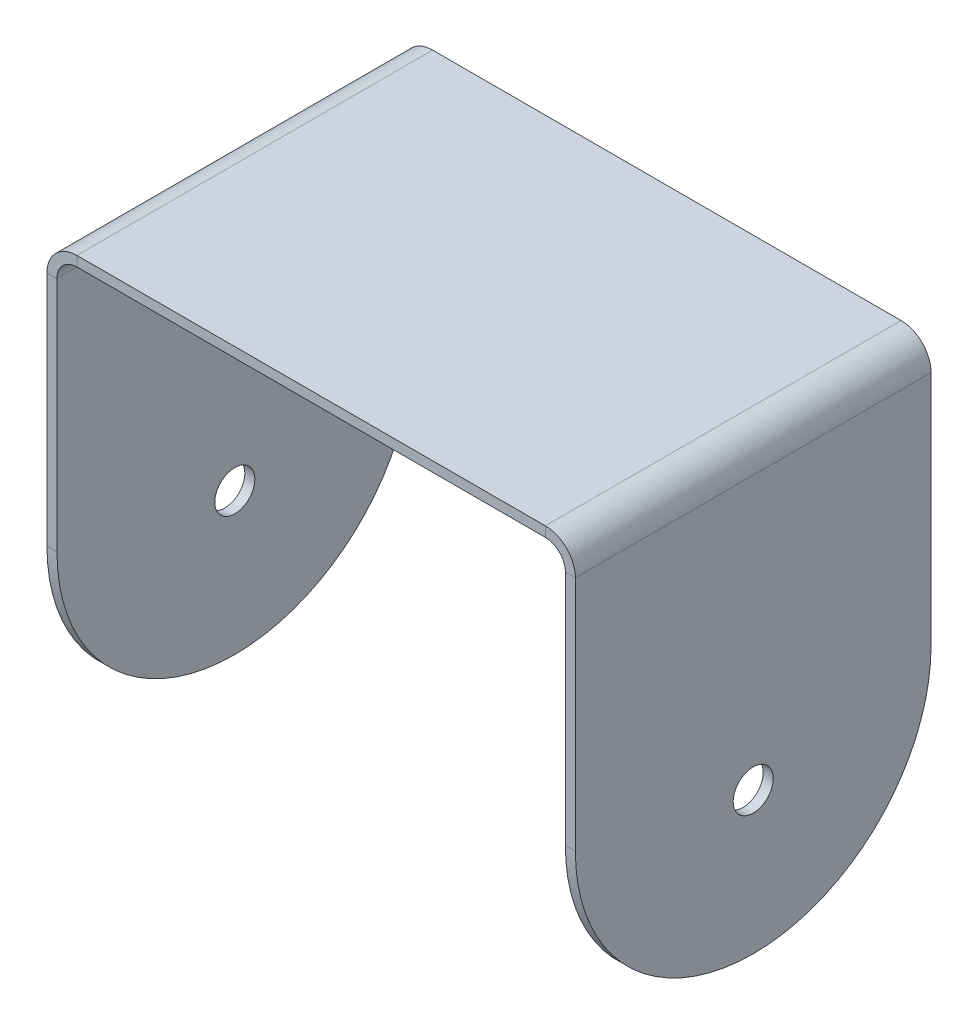
ISO-10303-21;
HEADER;
FILE_DESCRIPTION(('STEP AP214'),'2;1');
FILE_NAME('part.step','',(''),(''),'','','');
FILE_SCHEMA(('AUTOMOTIVE_DESIGN { 1 0 10303 214 1 1 1 1 }'));
ENDSEC;
DATA;
#1=APPLICATION_CONTEXT('core data for automotive mechanical design processes');
#2=APPLICATION_PROTOCOL_DEFINITION('international standard','automotive_design',2000,#1);
#3=PRODUCT_CONTEXT('',#1,'mechanical');
#4=PRODUCT('Part','Part','',(#3));
#5=PRODUCT_RELATED_PRODUCT_CATEGORY('part','',(#4));
#6=PRODUCT_DEFINITION_FORMATION('','',#4);
#7=PRODUCT_DEFINITION_CONTEXT('part definition',#1,'design');
#8=PRODUCT_DEFINITION('design','',#6,#7);
#9=PRODUCT_DEFINITION_SHAPE('','',#8);
#10=(LENGTH_UNIT() NAMED_UNIT(*) SI_UNIT(.MILLI.,.METRE.));
#11=(NAMED_UNIT(*) PLANE_ANGLE_UNIT() SI_UNIT($,.RADIAN.));
#12=(NAMED_UNIT(*) SI_UNIT($,.STERADIAN.) SOLID_ANGLE_UNIT());
#13=UNCERTAINTY_MEASURE_WITH_UNIT(LENGTH_MEASURE(1.E-05),#10,'distance_accuracy_value','');
#14=(GEOMETRIC_REPRESENTATION_CONTEXT(3) GLOBAL_UNCERTAINTY_ASSIGNED_CONTEXT((#13)) GLOBAL_UNIT_ASSIGNED_CONTEXT((#10,
#11,#12)) REPRESENTATION_CONTEXT('',''));
#15=CARTESIAN_POINT('',(0.,0.,0.));
#16=DIRECTION('',(0.,0.,1.));
#17=DIRECTION('',(1.,0.,0.));
#18=AXIS2_PLACEMENT_3D('',#15,#16,#17);
#19=CARTESIAN_POINT('',(34.3408,3.87818391192708,5.334));
#20=DIRECTION('',(0.,0.,1.));
#21=DIRECTION('',(-1.,0.,0.));
#22=AXIS2_PLACEMENT_3D('',#19,#20,#21);
#23=PLANE('',#22);
#24=DIRECTION('',(0.,1.,0.));
#25=VECTOR('',#24,1.);
#26=CARTESIAN_POINT('',(-30.4407999168,3.87818391192708,5.334));
#27=LINE('',#26,#25);
#28=CARTESIAN_POINT('',(-30.4407999168,2.57818391192708,5.334));
#29=VERTEX_POINT('',#28);
#30=CARTESIAN_POINT('',(-30.4407999168,3.87818391192708,5.334));
#31=VERTEX_POINT('',#30);
#32=EDGE_CURVE('E11',#29,#31,#27,.T.);
#33=ORIENTED_EDGE('',*,*,#32,.F.);
#34=DIRECTION('',(1.,0.,0.));
#35=VECTOR('',#34,1.);
#36=CARTESIAN_POINT('',(34.3408,2.57818391192708,5.334));
#37=LINE('',#36,#35);
#38=CARTESIAN_POINT('',(30.4407999168,2.57818391192708,5.334));
#39=VERTEX_POINT('',#38);
#40=EDGE_CURVE('E101',#39,#29,#37,.F.);
#41=ORIENTED_EDGE('',*,*,#40,.F.);
#42=DIRECTION('',(0.,1.,0.));
#43=VECTOR('',#42,1.);
#44=CARTESIAN_POINT('',(30.4407999168,3.87818391192708,5.334));
#45=LINE('',#44,#43);
#46=CARTESIAN_POINT('',(30.4407999168,3.87818391192708,5.334));
#47=VERTEX_POINT('',#46);
#48=EDGE_CURVE('E54',#39,#47,#45,.T.);
#49=ORIENTED_EDGE('',*,*,#48,.T.);
#50=DIRECTION('',(-1.,0.,0.));
#51=VECTOR('',#50,1.);
#52=CARTESIAN_POINT('',(34.3408,3.87818391192708,5.334));
#53=LINE('',#52,#51);
#54=EDGE_CURVE('E103',#47,#31,#53,.T.);
#55=ORIENTED_EDGE('',*,*,#54,.T.);
#56=EDGE_LOOP('',(#33,#41,#49,#55));
#57=FACE_BOUND('',#56,.T.);
#58=ADVANCED_FACE('F43',(#57),#23,.T.);
#59=CARTESIAN_POINT('',(30.4407999168,-0.0218161712729221,5.334));
#60=DIRECTION('',(0.,0.,1.));
#61=DIRECTION('',(0.,-1.,0.));
#62=AXIS2_PLACEMENT_3D('',#59,#60,#61);
#63=PLANE('',#62);
#64=ORIENTED_EDGE('',*,*,#48,.F.);
#65=CARTESIAN_POINT('',(30.4407999168,-0.0218161712729221,5.334));
#66=DIRECTION('',(0.,0.,1.));
#67=DIRECTION('',(0.,-1.,0.));
#68=AXIS2_PLACEMENT_3D('',#65,#66,#67);
#69=CIRCLE('',#68,2.6000000832);
#70=CARTESIAN_POINT('',(33.0408,-0.0218161712729221,5.334));
#71=VERTEX_POINT('',#70);
#72=EDGE_CURVE('E148',#39,#71,#69,.F.);
#73=ORIENTED_EDGE('',*,*,#72,.T.);
#74=DIRECTION('',(1.,0.,0.));
#75=VECTOR('',#74,1.);
#76=CARTESIAN_POINT('',(34.3408,-0.0218161712729221,5.334));
#77=LINE('',#76,#75);
#78=CARTESIAN_POINT('',(34.3408,-0.0218161712729221,5.334));
#79=VERTEX_POINT('',#78);
#80=EDGE_CURVE('E187',#71,#79,#77,.T.);
#81=ORIENTED_EDGE('',*,*,#80,.T.);
#82=CARTESIAN_POINT('',(30.4407999168,-0.0218161712729221,5.334));
#83=DIRECTION('',(0.,0.,-1.));
#84=DIRECTION('',(0.,1.,0.));
#85=AXIS2_PLACEMENT_3D('',#82,#83,#84);
#86=CIRCLE('',#85,3.9000000832);
#87=EDGE_CURVE('E257',#47,#79,#86,.T.);
#88=ORIENTED_EDGE('',*,*,#87,.F.);
#89=EDGE_LOOP('',(#64,#73,#81,#88));
#90=FACE_BOUND('',#89,.T.);
#91=ADVANCED_FACE('F301',(#90),#63,.T.);
#92=CARTESIAN_POINT('',(34.3408,-30.7928160880729,5.33400000000001));
#93=DIRECTION('',(0.,0.,-1.));
#94=DIRECTION('',(0.,-1.,0.));
#95=AXIS2_PLACEMENT_3D('',#92,#93,#94);
#96=PLANE('',#95);
#97=ORIENTED_EDGE('',*,*,#80,.F.);
#98=DIRECTION('',(0.,1.,0.));
#99=VECTOR('',#98,1.);
#100=CARTESIAN_POINT('',(33.0408,-30.7928160880729,5.334));
#101=LINE('',#100,#99);
#102=CARTESIAN_POINT('',(33.0408,-30.7928160880729,5.334));
#103=VERTEX_POINT('',#102);
#104=EDGE_CURVE('E155',#71,#103,#101,.F.);
#105=ORIENTED_EDGE('',*,*,#104,.T.);
#106=DIRECTION('',(1.,0.,0.));
#107=VECTOR('',#106,1.);
#108=CARTESIAN_POINT('',(34.3408,-30.7928160880729,5.334));
#109=LINE('',#108,#107);
#110=CARTESIAN_POINT('',(34.3408,-30.7928160880729,5.334));
#111=VERTEX_POINT('',#110);
#112=EDGE_CURVE('E183',#103,#111,#109,.T.);
#113=ORIENTED_EDGE('',*,*,#112,.T.);
#114=DIRECTION('',(0.,-1.,0.));
#115=VECTOR('',#114,1.);
#116=CARTESIAN_POINT('',(34.3408,-30.7928160880729,5.33400000000001));
#117=LINE('',#116,#115);
#118=EDGE_CURVE('E238',#79,#111,#117,.T.);
#119=ORIENTED_EDGE('',*,*,#118,.F.);
#120=EDGE_LOOP('',(#97,#105,#113,#119));
#121=FACE_BOUND('',#120,.T.);
#122=ADVANCED_FACE('F317',(#121),#96,.F.);
#123=CARTESIAN_POINT('',(34.3408,-30.7928160880729,-17.78));
#124=DIRECTION('',(-1.,0.,0.));
#125=DIRECTION('',(0.,0.,1.));
#126=AXIS2_PLACEMENT_3D('',#123,#124,#125);
#127=CYLINDRICAL_SURFACE('',#126,23.114);
#128=ORIENTED_EDGE('',*,*,#112,.F.);
#129=CARTESIAN_POINT('',(33.0408,-30.7928160880729,-17.78));
#130=DIRECTION('',(1.,0.,0.));
#131=DIRECTION('',(0.,0.,-1.));
#132=AXIS2_PLACEMENT_3D('',#129,#130,#131);
#133=CIRCLE('',#132,23.114);
#134=CARTESIAN_POINT('',(33.0408,-30.7928160880729,-40.894));
#135=VERTEX_POINT('',#134);
#136=EDGE_CURVE('E289',#103,#135,#133,.T.);
#137=ORIENTED_EDGE('',*,*,#136,.T.);
#138=DIRECTION('',(1.,0.,0.));
#139=VECTOR('',#138,1.);
#140=CARTESIAN_POINT('',(34.3408,-30.7928160880729,-40.894));
#141=LINE('',#140,#139);
#142=CARTESIAN_POINT('',(34.3408,-30.7928160880729,-40.894));
#143=VERTEX_POINT('',#142);
#144=EDGE_CURVE('E179',#135,#143,#141,.T.);
#145=ORIENTED_EDGE('',*,*,#144,.T.);
#146=CARTESIAN_POINT('',(34.3408,-30.7928160880729,-17.78));
#147=DIRECTION('',(1.,0.,0.));
#148=DIRECTION('',(0.,0.,1.));
#149=AXIS2_PLACEMENT_3D('',#146,#147,#148);
#150=CIRCLE('',#149,23.114);
#151=EDGE_CURVE('E234',#111,#143,#150,.T.);
#152=ORIENTED_EDGE('',*,*,#151,.F.);
#153=EDGE_LOOP('',(#128,#137,#145,#152));
#154=FACE_BOUND('',#153,.T.);
#155=ADVANCED_FACE('F313',(#154),#127,.T.);
#156=CARTESIAN_POINT('',(34.3408,3.87818391192708,-40.894));
#157=DIRECTION('',(0.,0.,1.));
#158=DIRECTION('',(0.,1.,0.));
#159=AXIS2_PLACEMENT_3D('',#156,#157,#158);
#160=PLANE('',#159);
#161=ORIENTED_EDGE('',*,*,#144,.F.);
#162=DIRECTION('',(0.,1.,0.));
#163=VECTOR('',#162,1.);
#164=CARTESIAN_POINT('',(33.0408,-30.7928160880729,-40.894));
#165=LINE('',#164,#163);
#166=CARTESIAN_POINT('',(33.0408,-0.0218161712729131,-40.894));
#167=VERTEX_POINT('',#166);
#168=EDGE_CURVE('E134',#135,#167,#165,.T.);
#169=ORIENTED_EDGE('',*,*,#168,.T.);
#170=DIRECTION('',(1.,0.,0.));
#171=VECTOR('',#170,1.);
#172=CARTESIAN_POINT('',(34.3408,-0.0218161712729136,-40.894));
#173=LINE('',#172,#171);
#174=CARTESIAN_POINT('',(34.3408,-0.0218161712729136,-40.894));
#175=VERTEX_POINT('',#174);
#176=EDGE_CURVE('E175',#167,#175,#173,.T.);
#177=ORIENTED_EDGE('',*,*,#176,.T.);
#178=DIRECTION('',(0.,1.,0.));
#179=VECTOR('',#178,1.);
#180=CARTESIAN_POINT('',(34.3408,3.87818391192708,-40.894));
#181=LINE('',#180,#179);
#182=EDGE_CURVE('E230',#143,#175,#181,.T.);
#183=ORIENTED_EDGE('',*,*,#182,.F.);
#184=EDGE_LOOP('',(#161,#169,#177,#183));
#185=FACE_BOUND('',#184,.T.);
#186=ADVANCED_FACE('F414',(#185),#160,.F.);
#187=CARTESIAN_POINT('',(30.4407999168,-0.0218161712729131,-40.894));
#188=DIRECTION('',(0.,0.,1.));
#189=DIRECTION('',(0.,-1.,0.));
#190=AXIS2_PLACEMENT_3D('',#187,#188,#189);
#191=PLANE('',#190);
#192=ORIENTED_EDGE('',*,*,#176,.F.);
#193=CARTESIAN_POINT('',(30.4407999168,-0.0218161712729131,-40.894));
#194=DIRECTION('',(0.,0.,1.));
#195=DIRECTION('',(0.,-1.,0.));
#196=AXIS2_PLACEMENT_3D('',#193,#194,#195);
#197=CIRCLE('',#196,2.6000000832);
#198=CARTESIAN_POINT('',(30.4407999168,2.57818391192709,-40.894));
#199=VERTEX_POINT('',#198);
#200=EDGE_CURVE('E141',#167,#199,#197,.T.);
#201=ORIENTED_EDGE('',*,*,#200,.T.);
#202=DIRECTION('',(0.,1.,0.));
#203=VECTOR('',#202,1.);
#204=CARTESIAN_POINT('',(30.4407999168,3.87818391192708,-40.894));
#205=LINE('',#204,#203);
#206=CARTESIAN_POINT('',(30.4407999168,3.87818391192708,-40.894));
#207=VERTEX_POINT('',#206);
#208=EDGE_CURVE('E172',#199,#207,#205,.T.);
#209=ORIENTED_EDGE('',*,*,#208,.T.);
#210=CARTESIAN_POINT('',(30.4407999168,-0.0218161712729131,-40.894));
#211=DIRECTION('',(0.,0.,-1.));
#212=DIRECTION('',(0.,1.,0.));
#213=AXIS2_PLACEMENT_3D('',#210,#211,#212);
#214=CIRCLE('',#213,3.9000000832);
#215=EDGE_CURVE('E253',#175,#207,#214,.F.);
#216=ORIENTED_EDGE('',*,*,#215,.F.);
#217=EDGE_LOOP('',(#192,#201,#209,#216));
#218=FACE_BOUND('',#217,.T.);
#219=ADVANCED_FACE('F410',(#218),#191,.F.);
#220=CARTESIAN_POINT('',(34.3408,3.87818391192708,-40.894));
#221=DIRECTION('',(0.,0.,1.));
#222=DIRECTION('',(-1.,0.,0.));
#223=AXIS2_PLACEMENT_3D('',#220,#221,#222);
#224=PLANE('',#223);
#225=ORIENTED_EDGE('',*,*,#208,.F.);
#226=DIRECTION('',(1.,0.,0.));
#227=VECTOR('',#226,1.);
#228=CARTESIAN_POINT('',(34.3408,2.57818391192709,-40.894));
#229=LINE('',#228,#227);
#230=CARTESIAN_POINT('',(-30.4407999168,2.57818391192709,-40.894));
#231=VERTEX_POINT('',#230);
#232=EDGE_CURVE('E133',#199,#231,#229,.F.);
#233=ORIENTED_EDGE('',*,*,#232,.T.);
#234=DIRECTION('',(0.,1.,0.));
#235=VECTOR('',#234,1.);
#236=CARTESIAN_POINT('',(-30.4407999168,3.87818391192708,-40.894));
#237=LINE('',#236,#235);
#238=CARTESIAN_POINT('',(-30.4407999168,3.87818391192708,-40.894));
#239=VERTEX_POINT('',#238);
#240=EDGE_CURVE('E168',#231,#239,#237,.T.);
#241=ORIENTED_EDGE('',*,*,#240,.T.);
#242=DIRECTION('',(-1.,0.,0.));
#243=VECTOR('',#242,1.);
#244=CARTESIAN_POINT('',(34.3408,3.87818391192708,-40.894));
#245=LINE('',#244,#243);
#246=EDGE_CURVE('E224',#207,#239,#245,.T.);
#247=ORIENTED_EDGE('',*,*,#246,.F.);
#248=EDGE_LOOP('',(#225,#233,#241,#247));
#249=FACE_BOUND('',#248,.T.);
#250=ADVANCED_FACE('F407',(#249),#224,.F.);
#251=CARTESIAN_POINT('',(-30.4407999168,-0.0218161712729153,-40.894));
#252=DIRECTION('',(0.,0.,-1.));
#253=DIRECTION('',(0.,1.,0.));
#254=AXIS2_PLACEMENT_3D('',#251,#252,#253);
#255=PLANE('',#254);
#256=ORIENTED_EDGE('',*,*,#240,.F.);
#257=CARTESIAN_POINT('',(-30.4407999168,-0.0218161712729153,-40.894));
#258=DIRECTION('',(0.,0.,-1.));
#259=DIRECTION('',(0.,1.,0.));
#260=AXIS2_PLACEMENT_3D('',#257,#258,#259);
#261=CIRCLE('',#260,2.6000000832);
#262=CARTESIAN_POINT('',(-33.0408,-0.0218161712729159,-40.894));
#263=VERTEX_POINT('',#262);
#264=EDGE_CURVE('E119',#231,#263,#261,.F.);
#265=ORIENTED_EDGE('',*,*,#264,.T.);
#266=DIRECTION('',(-1.,0.,0.));
#267=VECTOR('',#266,1.);
#268=CARTESIAN_POINT('',(-34.3408,-0.0218161712729153,-40.894));
#269=LINE('',#268,#267);
#270=CARTESIAN_POINT('',(-34.3408,-0.0218161712729153,-40.894));
#271=VERTEX_POINT('',#270);
#272=EDGE_CURVE('E164',#263,#271,#269,.T.);
#273=ORIENTED_EDGE('',*,*,#272,.T.);
#274=CARTESIAN_POINT('',(-30.4407999168,-0.0218161712729153,-40.894));
#275=DIRECTION('',(0.,0.,1.));
#276=DIRECTION('',(0.,-1.,0.));
#277=AXIS2_PLACEMENT_3D('',#274,#275,#276);
#278=CIRCLE('',#277,3.9000000832);
#279=EDGE_CURVE('E246',#239,#271,#278,.T.);
#280=ORIENTED_EDGE('',*,*,#279,.F.);
#281=EDGE_LOOP('',(#256,#265,#273,#280));
#282=FACE_BOUND('',#281,.T.);
#283=ADVANCED_FACE('F361',(#282),#255,.T.);
#284=CARTESIAN_POINT('',(-34.3408,3.87818391192708,-40.894));
#285=DIRECTION('',(0.,0.,1.));
#286=DIRECTION('',(0.,1.,0.));
#287=AXIS2_PLACEMENT_3D('',#284,#285,#286);
#288=PLANE('',#287);
#289=ORIENTED_EDGE('',*,*,#272,.F.);
#290=DIRECTION('',(0.,1.,0.));
#291=VECTOR('',#290,1.);
#292=CARTESIAN_POINT('',(-33.0408,-30.7928160880729,-40.894));
#293=LINE('',#292,#291);
#294=CARTESIAN_POINT('',(-33.0408,-30.7928160880729,-40.894));
#295=VERTEX_POINT('',#294);
#296=EDGE_CURVE('E272',#295,#263,#293,.T.);
#297=ORIENTED_EDGE('',*,*,#296,.F.);
#298=DIRECTION('',(-1.,0.,0.));
#299=VECTOR('',#298,1.);
#300=CARTESIAN_POINT('',(-34.3408,-30.7928160880729,-40.894));
#301=LINE('',#300,#299);
#302=CARTESIAN_POINT('',(-34.3408,-30.7928160880729,-40.894));
#303=VERTEX_POINT('',#302);
#304=EDGE_CURVE('E160',#295,#303,#301,.T.);
#305=ORIENTED_EDGE('',*,*,#304,.T.);
#306=DIRECTION('',(0.,1.,0.));
#307=VECTOR('',#306,1.);
#308=CARTESIAN_POINT('',(-34.3408,3.87818391192708,-40.894));
#309=LINE('',#308,#307);
#310=EDGE_CURVE('E212',#303,#271,#309,.T.);
#311=ORIENTED_EDGE('',*,*,#310,.T.);
#312=EDGE_LOOP('',(#289,#297,#305,#311));
#313=FACE_BOUND('',#312,.T.);
#314=ADVANCED_FACE('F345',(#313),#288,.F.);
#315=CARTESIAN_POINT('',(-34.3408,-30.7928160880729,-17.78));
#316=DIRECTION('',(-1.,0.,0.));
#317=DIRECTION('',(0.,0.,1.));
#318=AXIS2_PLACEMENT_3D('',#315,#316,#317);
#319=CYLINDRICAL_SURFACE('',#318,23.114);
#320=ORIENTED_EDGE('',*,*,#304,.F.);
#321=CARTESIAN_POINT('',(-33.0408,-30.7928160880729,-17.78));
#322=DIRECTION('',(1.,0.,0.));
#323=DIRECTION('',(0.,0.,-1.));
#324=AXIS2_PLACEMENT_3D('',#321,#322,#323);
#325=CIRCLE('',#324,23.114);
#326=CARTESIAN_POINT('',(-33.0408,-30.7928160880729,5.334));
#327=VERTEX_POINT('',#326);
#328=EDGE_CURVE('E125',#327,#295,#325,.T.);
#329=ORIENTED_EDGE('',*,*,#328,.F.);
#330=DIRECTION('',(-1.,0.,0.));
#331=VECTOR('',#330,1.);
#332=CARTESIAN_POINT('',(-34.3408,-30.7928160880729,5.334));
#333=LINE('',#332,#331);
#334=CARTESIAN_POINT('',(-34.3408,-30.7928160880729,5.334));
#335=VERTEX_POINT('',#334);
#336=EDGE_CURVE('E156',#327,#335,#333,.T.);
#337=ORIENTED_EDGE('',*,*,#336,.T.);
#338=CARTESIAN_POINT('',(-34.3408,-30.7928160880729,-17.78));
#339=DIRECTION('',(1.,0.,0.));
#340=DIRECTION('',(0.,0.,1.));
#341=AXIS2_PLACEMENT_3D('',#338,#339,#340);
#342=CIRCLE('',#341,23.114);
#343=EDGE_CURVE('E208',#335,#303,#342,.T.);
#344=ORIENTED_EDGE('',*,*,#343,.T.);
#345=EDGE_LOOP('',(#320,#329,#337,#344));
#346=FACE_BOUND('',#345,.T.);
#347=ADVANCED_FACE('F353',(#346),#319,.T.);
#348=CARTESIAN_POINT('',(-34.3408,-30.7928160880729,5.33400000000001));
#349=DIRECTION('',(0.,0.,-1.));
#350=DIRECTION('',(0.,-1.,0.));
#351=AXIS2_PLACEMENT_3D('',#348,#349,#350);
#352=PLANE('',#351);
#353=ORIENTED_EDGE('',*,*,#336,.F.);
#354=DIRECTION('',(0.,1.,0.));
#355=VECTOR('',#354,1.);
#356=CARTESIAN_POINT('',(-33.0408,-30.7928160880729,5.334));
#357=LINE('',#356,#355);
#358=CARTESIAN_POINT('',(-33.0408,-0.0218161712729221,5.334));
#359=VERTEX_POINT('',#358);
#360=EDGE_CURVE('E276',#359,#327,#357,.F.);
#361=ORIENTED_EDGE('',*,*,#360,.F.);
#362=DIRECTION('',(-1.,0.,0.));
#363=VECTOR('',#362,1.);
#364=CARTESIAN_POINT('',(-34.3408,-0.0218161712729221,5.334));
#365=LINE('',#364,#363);
#366=CARTESIAN_POINT('',(-34.3408,-0.0218161712729221,5.334));
#367=VERTEX_POINT('',#366);
#368=EDGE_CURVE('E47',#359,#367,#365,.T.);
#369=ORIENTED_EDGE('',*,*,#368,.T.);
#370=DIRECTION('',(0.,-1.,0.));
#371=VECTOR('',#370,1.);
#372=CARTESIAN_POINT('',(-34.3408,-30.7928160880729,5.33400000000001));
#373=LINE('',#372,#371);
#374=EDGE_CURVE('E216',#367,#335,#373,.T.);
#375=ORIENTED_EDGE('',*,*,#374,.T.);
#376=EDGE_LOOP('',(#353,#361,#369,#375));
#377=FACE_BOUND('',#376,.T.);
#378=ADVANCED_FACE('F355',(#377),#352,.F.);
#379=CARTESIAN_POINT('',(34.3408,-35.4614991598116,-17.78));
#380=DIRECTION('',(-1.,0.,0.));
#381=DIRECTION('',(0.,0.,1.));
#382=AXIS2_PLACEMENT_3D('',#379,#380,#381);
#383=CYLINDRICAL_SURFACE('',#382,2.6000000832);
#384=CARTESIAN_POINT('',(34.3408,-35.4614991598116,-17.78));
#385=DIRECTION('',(1.,0.,0.));
#386=DIRECTION('',(0.,0.,-1.));
#387=AXIS2_PLACEMENT_3D('',#384,#385,#386);
#388=CIRCLE('',#387,2.6000000832);
#389=CARTESIAN_POINT('',(34.3408,-35.4614991598116,-20.3800000832));
#390=VERTEX_POINT('',#389);
#391=EDGE_CURVE('E242',#390,#390,#388,.T.);
#392=ORIENTED_EDGE('',*,*,#391,.T.);
#393=EDGE_LOOP('',(#392));
#394=FACE_BOUND('',#393,.T.);
#395=CARTESIAN_POINT('',(33.0408,-35.4614991598116,-17.78));
#396=DIRECTION('',(1.,0.,0.));
#397=DIRECTION('',(0.,0.,-1.));
#398=AXIS2_PLACEMENT_3D('',#395,#396,#397);
#399=CIRCLE('',#398,2.6000000832);
#400=CARTESIAN_POINT('',(33.0408,-35.4614991598116,-20.3800000832));
#401=VERTEX_POINT('',#400);
#402=EDGE_CURVE('E145',#401,#401,#399,.T.);
#403=ORIENTED_EDGE('',*,*,#402,.F.);
#404=EDGE_LOOP('',(#403));
#405=FACE_BOUND('',#404,.T.);
#406=ADVANCED_FACE('F45',(#394,#405),#383,.F.);
#407=CARTESIAN_POINT('',(-34.3408,-35.4614991598116,-17.78));
#408=DIRECTION('',(-1.,0.,0.));
#409=DIRECTION('',(0.,0.,1.));
#410=AXIS2_PLACEMENT_3D('',#407,#408,#409);
#411=CYLINDRICAL_SURFACE('',#410,2.6000000832);
#412=CARTESIAN_POINT('',(-34.3408,-35.4614991598116,-17.78));
#413=DIRECTION('',(-1.,0.,0.));
#414=DIRECTION('',(0.,0.,1.));
#415=AXIS2_PLACEMENT_3D('',#412,#413,#414);
#416=CIRCLE('',#415,2.6000000832);
#417=CARTESIAN_POINT('',(-34.3408,-35.4614991598116,-15.1799999168));
#418=VERTEX_POINT('',#417);
#419=EDGE_CURVE('E220',#418,#418,#416,.T.);
#420=ORIENTED_EDGE('',*,*,#419,.T.);
#421=EDGE_LOOP('',(#420));
#422=FACE_BOUND('',#421,.T.);
#423=CARTESIAN_POINT('',(-33.0408,-35.4614991598116,-17.78));
#424=DIRECTION('',(-1.,0.,0.));
#425=DIRECTION('',(0.,0.,1.));
#426=AXIS2_PLACEMENT_3D('',#423,#424,#425);
#427=CIRCLE('',#426,2.6000000832);
#428=CARTESIAN_POINT('',(-33.0408,-35.4614991598116,-15.1799999168));
#429=VERTEX_POINT('',#428);
#430=EDGE_CURVE('E280',#429,#429,#427,.T.);
#431=ORIENTED_EDGE('',*,*,#430,.F.);
#432=EDGE_LOOP('',(#431));
#433=FACE_BOUND('',#432,.T.);
#434=ADVANCED_FACE('F381',(#422,#433),#411,.F.);
#435=CARTESIAN_POINT('',(-30.4407999168,-0.0218161712729238,5.334));
#436=DIRECTION('',(0.,0.,-1.));
#437=DIRECTION('',(0.,1.,0.));
#438=AXIS2_PLACEMENT_3D('',#435,#436,#437);
#439=PLANE('',#438);
#440=CARTESIAN_POINT('',(-30.4407999168,-0.0218161712729238,5.334));
#441=DIRECTION('',(0.,0.,-1.));
#442=DIRECTION('',(0.,1.,0.));
#443=AXIS2_PLACEMENT_3D('',#440,#441,#442);
#444=CIRCLE('',#443,2.6000000832);
#445=EDGE_CURVE('E116',#359,#29,#444,.T.);
#446=ORIENTED_EDGE('',*,*,#445,.T.);
#447=ORIENTED_EDGE('',*,*,#32,.T.);
#448=CARTESIAN_POINT('',(-30.4407999168,-0.0218161712729238,5.334));
#449=DIRECTION('',(0.,0.,1.));
#450=DIRECTION('',(0.,-1.,0.));
#451=AXIS2_PLACEMENT_3D('',#448,#449,#450);
#452=CIRCLE('',#451,3.9000000832);
#453=EDGE_CURVE('E250',#367,#31,#452,.F.);
#454=ORIENTED_EDGE('',*,*,#453,.F.);
#455=ORIENTED_EDGE('',*,*,#368,.F.);
#456=EDGE_LOOP('',(#446,#447,#454,#455));
#457=FACE_BOUND('',#456,.T.);
#458=ADVANCED_FACE('F137',(#457),#439,.F.);
#459=CARTESIAN_POINT('',(-34.3408,-30.7928160880729,-17.78));
#460=DIRECTION('',(-1.,0.,0.));
#461=DIRECTION('',(0.,0.,1.));
#462=AXIS2_PLACEMENT_3D('',#459,#460,#461);
#463=PLANE('',#462);
#464=ORIENTED_EDGE('',*,*,#419,.F.);
#465=EDGE_LOOP('',(#464));
#466=FACE_BOUND('',#465,.T.);
#467=ORIENTED_EDGE('',*,*,#374,.F.);
#468=DIRECTION('',(0.,0.,1.));
#469=VECTOR('',#468,1.);
#470=CARTESIAN_POINT('',(-34.3408,-0.0218161712729153,-40.894));
#471=LINE('',#470,#469);
#472=EDGE_CURVE('E201',#367,#271,#471,.F.);
#473=ORIENTED_EDGE('',*,*,#472,.T.);
#474=ORIENTED_EDGE('',*,*,#310,.F.);
#475=ORIENTED_EDGE('',*,*,#343,.F.);
#476=EDGE_LOOP('',(#467,#473,#474,#475));
#477=FACE_BOUND('',#476,.T.);
#478=ADVANCED_FACE('F351',(#466,#477),#463,.T.);
#479=CARTESIAN_POINT('',(34.3408,3.87818391192708,5.334));
#480=DIRECTION('',(0.,-1.,0.));
#481=DIRECTION('',(0.,0.,-1.));
#482=AXIS2_PLACEMENT_3D('',#479,#480,#481);
#483=PLANE('',#482);
#484=ORIENTED_EDGE('',*,*,#54,.F.);
#485=DIRECTION('',(0.,0.,1.));
#486=VECTOR('',#485,1.);
#487=CARTESIAN_POINT('',(30.4407999168,3.87818391192708,5.334));
#488=LINE('',#487,#486);
#489=EDGE_CURVE('E194',#47,#207,#488,.F.);
#490=ORIENTED_EDGE('',*,*,#489,.T.);
#491=ORIENTED_EDGE('',*,*,#246,.T.);
#492=DIRECTION('',(0.,0.,1.));
#493=VECTOR('',#492,1.);
#494=CARTESIAN_POINT('',(-30.4407999168,3.87818391192708,5.334));
#495=LINE('',#494,#493);
#496=EDGE_CURVE('E205',#239,#31,#495,.T.);
#497=ORIENTED_EDGE('',*,*,#496,.T.);
#498=EDGE_LOOP('',(#484,#490,#491,#497));
#499=FACE_BOUND('',#498,.T.);
#500=ADVANCED_FACE('F386',(#499),#483,.F.);
#501=CARTESIAN_POINT('',(34.3408,-30.7928160880729,-17.78));
#502=DIRECTION('',(-1.,0.,0.));
#503=DIRECTION('',(0.,0.,1.));
#504=AXIS2_PLACEMENT_3D('',#501,#502,#503);
#505=PLANE('',#504);
#506=ORIENTED_EDGE('',*,*,#391,.F.);
#507=EDGE_LOOP('',(#506));
#508=FACE_BOUND('',#507,.T.);
#509=ORIENTED_EDGE('',*,*,#182,.T.);
#510=DIRECTION('',(0.,0.,1.));
#511=VECTOR('',#510,1.);
#512=CARTESIAN_POINT('',(34.3408,-0.0218161712729176,-17.78));
#513=LINE('',#512,#511);
#514=EDGE_CURVE('E197',#175,#79,#513,.T.);
#515=ORIENTED_EDGE('',*,*,#514,.T.);
#516=ORIENTED_EDGE('',*,*,#118,.T.);
#517=ORIENTED_EDGE('',*,*,#151,.T.);
#518=EDGE_LOOP('',(#509,#515,#516,#517));
#519=FACE_BOUND('',#518,.T.);
#520=ADVANCED_FACE('F320',(#508,#519),#505,.F.);
#521=CARTESIAN_POINT('',(-30.4407999168,-0.0218161712729238,5.334));
#522=DIRECTION('',(0.,0.,-1.));
#523=DIRECTION('',(0.,1.,0.));
#524=AXIS2_PLACEMENT_3D('',#521,#522,#523);
#525=CYLINDRICAL_SURFACE('',#524,3.9000000832);
#526=ORIENTED_EDGE('',*,*,#279,.T.);
#527=ORIENTED_EDGE('',*,*,#472,.F.);
#528=ORIENTED_EDGE('',*,*,#453,.T.);
#529=ORIENTED_EDGE('',*,*,#496,.F.);
#530=EDGE_LOOP('',(#526,#527,#528,#529));
#531=FACE_BOUND('',#530,.T.);
#532=ADVANCED_FACE('F358',(#531),#525,.T.);
#533=CARTESIAN_POINT('',(30.4407999168,-0.0218161712729176,-17.78));
#534=DIRECTION('',(0.,0.,1.));
#535=DIRECTION('',(0.,-1.,0.));
#536=AXIS2_PLACEMENT_3D('',#533,#534,#535);
#537=CYLINDRICAL_SURFACE('',#536,3.9000000832);
#538=ORIENTED_EDGE('',*,*,#215,.T.);
#539=ORIENTED_EDGE('',*,*,#489,.F.);
#540=ORIENTED_EDGE('',*,*,#87,.T.);
#541=ORIENTED_EDGE('',*,*,#514,.F.);
#542=EDGE_LOOP('',(#538,#539,#540,#541));
#543=FACE_BOUND('',#542,.T.);
#544=ADVANCED_FACE('F327',(#543),#537,.T.);
#545=CARTESIAN_POINT('',(-33.0408,-30.7928160880729,-17.78));
#546=DIRECTION('',(-1.,0.,0.));
#547=DIRECTION('',(0.,0.,1.));
#548=AXIS2_PLACEMENT_3D('',#545,#546,#547);
#549=PLANE('',#548);
#550=ORIENTED_EDGE('',*,*,#430,.T.);
#551=EDGE_LOOP('',(#550));
#552=FACE_BOUND('',#551,.T.);
#553=ORIENTED_EDGE('',*,*,#360,.T.);
#554=ORIENTED_EDGE('',*,*,#328,.T.);
#555=ORIENTED_EDGE('',*,*,#296,.T.);
#556=DIRECTION('',(0.,0.,1.));
#557=VECTOR('',#556,1.);
#558=CARTESIAN_POINT('',(-33.0408,-0.0218161712729221,-17.78));
#559=LINE('',#558,#557);
#560=EDGE_CURVE('E124',#359,#263,#559,.F.);
#561=ORIENTED_EDGE('',*,*,#560,.F.);
#562=EDGE_LOOP('',(#553,#554,#555,#561));
#563=FACE_BOUND('',#562,.T.);
#564=ADVANCED_FACE('F363',(#552,#563),#549,.F.);
#565=CARTESIAN_POINT('',(34.3408,2.57818391192708,5.334));
#566=DIRECTION('',(0.,-1.,0.));
#567=DIRECTION('',(0.,0.,-1.));
#568=AXIS2_PLACEMENT_3D('',#565,#566,#567);
#569=PLANE('',#568);
#570=ORIENTED_EDGE('',*,*,#40,.T.);
#571=DIRECTION('',(0.,0.,-1.));
#572=VECTOR('',#571,1.);
#573=CARTESIAN_POINT('',(-30.4407999168,2.57818391192708,5.334));
#574=LINE('',#573,#572);
#575=EDGE_CURVE('E113',#231,#29,#574,.F.);
#576=ORIENTED_EDGE('',*,*,#575,.F.);
#577=ORIENTED_EDGE('',*,*,#232,.F.);
#578=DIRECTION('',(0.,0.,-1.));
#579=VECTOR('',#578,1.);
#580=CARTESIAN_POINT('',(30.4407999168,2.57818391192708,5.334));
#581=LINE('',#580,#579);
#582=EDGE_CURVE('E130',#39,#199,#581,.T.);
#583=ORIENTED_EDGE('',*,*,#582,.F.);
#584=EDGE_LOOP('',(#570,#576,#577,#583));
#585=FACE_BOUND('',#584,.T.);
#586=ADVANCED_FACE('F128',(#585),#569,.T.);
#587=CARTESIAN_POINT('',(33.0408,-30.7928160880729,-17.78));
#588=DIRECTION('',(-1.,0.,0.));
#589=DIRECTION('',(0.,0.,1.));
#590=AXIS2_PLACEMENT_3D('',#587,#588,#589);
#591=PLANE('',#590);
#592=ORIENTED_EDGE('',*,*,#402,.T.);
#593=EDGE_LOOP('',(#592));
#594=FACE_BOUND('',#593,.T.);
#595=ORIENTED_EDGE('',*,*,#168,.F.);
#596=ORIENTED_EDGE('',*,*,#136,.F.);
#597=ORIENTED_EDGE('',*,*,#104,.F.);
#598=DIRECTION('',(0.,0.,1.));
#599=VECTOR('',#598,1.);
#600=CARTESIAN_POINT('',(33.0408,-0.0218161712729131,-17.78));
#601=LINE('',#600,#599);
#602=EDGE_CURVE('E263',#167,#71,#601,.T.);
#603=ORIENTED_EDGE('',*,*,#602,.F.);
#604=EDGE_LOOP('',(#595,#596,#597,#603));
#605=FACE_BOUND('',#604,.T.);
#606=ADVANCED_FACE('F311',(#594,#605),#591,.T.);
#607=CARTESIAN_POINT('',(-30.4407999168,-0.0218161712729238,5.334));
#608=DIRECTION('',(0.,0.,-1.));
#609=DIRECTION('',(0.,1.,0.));
#610=AXIS2_PLACEMENT_3D('',#607,#608,#609);
#611=CYLINDRICAL_SURFACE('',#610,2.6000000832);
#612=ORIENTED_EDGE('',*,*,#264,.F.);
#613=ORIENTED_EDGE('',*,*,#575,.T.);
#614=ORIENTED_EDGE('',*,*,#445,.F.);
#615=ORIENTED_EDGE('',*,*,#560,.T.);
#616=EDGE_LOOP('',(#612,#613,#614,#615));
#617=FACE_BOUND('',#616,.T.);
#618=ADVANCED_FACE('F114',(#617),#611,.F.);
#619=CARTESIAN_POINT('',(30.4407999168,-0.0218161712729176,-17.78));
#620=DIRECTION('',(0.,0.,1.));
#621=DIRECTION('',(0.,-1.,0.));
#622=AXIS2_PLACEMENT_3D('',#619,#620,#621);
#623=CYLINDRICAL_SURFACE('',#622,2.6000000832);
#624=ORIENTED_EDGE('',*,*,#200,.F.);
#625=ORIENTED_EDGE('',*,*,#602,.T.);
#626=ORIENTED_EDGE('',*,*,#72,.F.);
#627=ORIENTED_EDGE('',*,*,#582,.T.);
#628=EDGE_LOOP('',(#624,#625,#626,#627));
#629=FACE_BOUND('',#628,.T.);
#630=ADVANCED_FACE('F306',(#629),#623,.F.);
#631=CLOSED_SHELL('',(#58,#91,#122,#155,#186,#219,#250,#283,#314,#347,#378,#406,#434,#458,#478,
#500,#520,#532,#544,#564,#586,#606,#618,#630));
#632=MANIFOLD_SOLID_BREP('B2',#631);
#633=ADVANCED_BREP_SHAPE_REPRESENTATION('',(#18,#632),#14);
#634=SHAPE_DEFINITION_REPRESENTATION(#9,#633);
ENDSEC;
END-ISO-10303-21;
